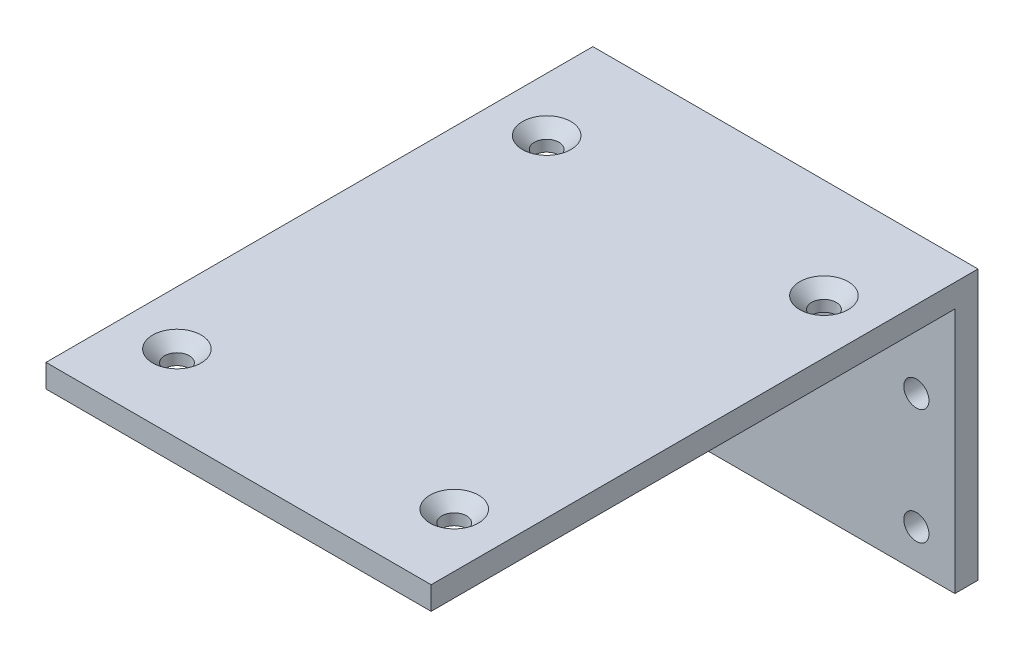
ISO-10303-21;
HEADER;
FILE_DESCRIPTION(('STEP AP214'),'2;1');
FILE_NAME('part.step','',(''),(''),'','','');
FILE_SCHEMA(('AUTOMOTIVE_DESIGN { 1 0 10303 214 1 1 1 1 }'));
ENDSEC;
DATA;
#1=APPLICATION_CONTEXT('core data for automotive mechanical design processes');
#2=APPLICATION_PROTOCOL_DEFINITION('international standard','automotive_design',2000,#1);
#3=PRODUCT_CONTEXT('',#1,'mechanical');
#4=PRODUCT('Part','Part','',(#3));
#5=PRODUCT_RELATED_PRODUCT_CATEGORY('part','',(#4));
#6=PRODUCT_DEFINITION_FORMATION('','',#4);
#7=PRODUCT_DEFINITION_CONTEXT('part definition',#1,'design');
#8=PRODUCT_DEFINITION('design','',#6,#7);
#9=PRODUCT_DEFINITION_SHAPE('','',#8);
#10=(LENGTH_UNIT() NAMED_UNIT(*) SI_UNIT(.MILLI.,.METRE.));
#11=(NAMED_UNIT(*) PLANE_ANGLE_UNIT() SI_UNIT($,.RADIAN.));
#12=(NAMED_UNIT(*) SI_UNIT($,.STERADIAN.) SOLID_ANGLE_UNIT());
#13=UNCERTAINTY_MEASURE_WITH_UNIT(LENGTH_MEASURE(1.E-05),#10,'distance_accuracy_value','');
#14=(GEOMETRIC_REPRESENTATION_CONTEXT(3) GLOBAL_UNCERTAINTY_ASSIGNED_CONTEXT((#13)) GLOBAL_UNIT_ASSIGNED_CONTEXT((#10,
#11,#12)) REPRESENTATION_CONTEXT('',''));
#15=CARTESIAN_POINT('',(0.,0.,0.));
#16=DIRECTION('',(0.,0.,1.));
#17=DIRECTION('',(1.,0.,0.));
#18=AXIS2_PLACEMENT_3D('',#15,#16,#17);
#19=CARTESIAN_POINT('',(0.,0.,153.));
#20=DIRECTION('',(0.,0.,-1.));
#21=DIRECTION('',(-1.,0.,0.));
#22=AXIS2_PLACEMENT_3D('',#19,#20,#21);
#23=PLANE('',#22);
#24=DIRECTION('',(0.,1.,0.));
#25=VECTOR('',#24,1.);
#26=CARTESIAN_POINT('',(25.,25.,153.));
#27=LINE('',#26,#25);
#28=CARTESIAN_POINT('',(25.,25.,153.));
#29=VERTEX_POINT('',#28);
#30=CARTESIAN_POINT('',(25.,57.,153.));
#31=VERTEX_POINT('',#30);
#32=EDGE_CURVE('E94',#29,#31,#27,.T.);
#33=ORIENTED_EDGE('',*,*,#32,.T.);
#34=DIRECTION('',(-1.,0.,0.));
#35=VECTOR('',#34,1.);
#36=CARTESIAN_POINT('',(-25.,57.,153.));
#37=LINE('',#36,#35);
#38=CARTESIAN_POINT('',(-25.0000000000001,57.,153.));
#39=VERTEX_POINT('',#38);
#40=EDGE_CURVE('E138',#31,#39,#37,.T.);
#41=ORIENTED_EDGE('',*,*,#40,.T.);
#42=DIRECTION('',(0.,-1.,0.));
#43=VECTOR('',#42,1.);
#44=CARTESIAN_POINT('',(-25.0000000000001,25.,153.));
#45=LINE('',#44,#43);
#46=CARTESIAN_POINT('',(-25.0000000000001,25.,153.));
#47=VERTEX_POINT('',#46);
#48=EDGE_CURVE('E148',#39,#47,#45,.T.);
#49=ORIENTED_EDGE('',*,*,#48,.T.);
#50=DIRECTION('',(1.,0.,0.));
#51=VECTOR('',#50,1.);
#52=CARTESIAN_POINT('',(-25.0000000000001,25.,153.));
#53=LINE('',#52,#51);
#54=EDGE_CURVE('E65',#47,#29,#53,.T.);
#55=ORIENTED_EDGE('',*,*,#54,.T.);
#56=EDGE_LOOP('',(#33,#41,#49,#55));
#57=FACE_BOUND('',#56,.T.);
#58=CARTESIAN_POINT('',(20.,30.,153.));
#59=DIRECTION('',(0.,0.,1.));
#60=DIRECTION('',(1.,0.,0.));
#61=AXIS2_PLACEMENT_3D('',#58,#59,#60);
#62=CIRCLE('',#61,1.635);
#63=CARTESIAN_POINT('',(21.6350000000001,30.,153.));
#64=VERTEX_POINT('',#63);
#65=EDGE_CURVE('E106',#64,#64,#62,.T.);
#66=ORIENTED_EDGE('',*,*,#65,.F.);
#67=EDGE_LOOP('',(#66));
#68=FACE_BOUND('',#67,.T.);
#69=CARTESIAN_POINT('',(20.,45.,153.));
#70=DIRECTION('',(0.,0.,1.));
#71=DIRECTION('',(1.,0.,0.));
#72=AXIS2_PLACEMENT_3D('',#69,#70,#71);
#73=CIRCLE('',#72,1.635);
#74=CARTESIAN_POINT('',(21.635,45.,153.));
#75=VERTEX_POINT('',#74);
#76=EDGE_CURVE('E152',#75,#75,#73,.T.);
#77=ORIENTED_EDGE('',*,*,#76,.F.);
#78=EDGE_LOOP('',(#77));
#79=FACE_BOUND('',#78,.T.);
#80=CARTESIAN_POINT('',(-20.,45.,153.));
#81=DIRECTION('',(0.,0.,1.));
#82=DIRECTION('',(1.,0.,0.));
#83=AXIS2_PLACEMENT_3D('',#80,#81,#82);
#84=CIRCLE('',#83,1.635);
#85=CARTESIAN_POINT('',(-18.365,45.,153.));
#86=VERTEX_POINT('',#85);
#87=EDGE_CURVE('E157',#86,#86,#84,.T.);
#88=ORIENTED_EDGE('',*,*,#87,.F.);
#89=EDGE_LOOP('',(#88));
#90=FACE_BOUND('',#89,.T.);
#91=CARTESIAN_POINT('',(-20.,30.,153.));
#92=DIRECTION('',(0.,0.,1.));
#93=DIRECTION('',(1.,0.,0.));
#94=AXIS2_PLACEMENT_3D('',#91,#92,#93);
#95=CIRCLE('',#94,1.635);
#96=CARTESIAN_POINT('',(-18.365,30.,153.));
#97=VERTEX_POINT('',#96);
#98=EDGE_CURVE('E163',#97,#97,#95,.T.);
#99=ORIENTED_EDGE('',*,*,#98,.F.);
#100=EDGE_LOOP('',(#99));
#101=FACE_BOUND('',#100,.T.);
#102=ADVANCED_FACE('F41',(#57,#68,#79,#90,#101),#23,.F.);
#103=CARTESIAN_POINT('',(0.,0.,150.));
#104=DIRECTION('',(0.,0.,-1.));
#105=DIRECTION('',(-1.,0.,0.));
#106=AXIS2_PLACEMENT_3D('',#103,#104,#105);
#107=PLANE('',#106);
#108=CARTESIAN_POINT('',(-20.,45.,150.));
#109=DIRECTION('',(0.,0.,1.));
#110=DIRECTION('',(1.,0.,0.));
#111=AXIS2_PLACEMENT_3D('',#108,#109,#110);
#112=CIRCLE('',#111,1.635);
#113=CARTESIAN_POINT('',(-18.365,45.,150.));
#114=VERTEX_POINT('',#113);
#115=EDGE_CURVE('E160',#114,#114,#112,.T.);
#116=ORIENTED_EDGE('',*,*,#115,.T.);
#117=EDGE_LOOP('',(#116));
#118=FACE_BOUND('',#117,.T.);
#119=CARTESIAN_POINT('',(20.,30.,150.));
#120=DIRECTION('',(0.,0.,1.));
#121=DIRECTION('',(1.,0.,0.));
#122=AXIS2_PLACEMENT_3D('',#119,#120,#121);
#123=CIRCLE('',#122,1.635);
#124=CARTESIAN_POINT('',(21.6350000000001,30.,150.));
#125=VERTEX_POINT('',#124);
#126=EDGE_CURVE('E110',#125,#125,#123,.T.);
#127=ORIENTED_EDGE('',*,*,#126,.T.);
#128=EDGE_LOOP('',(#127));
#129=FACE_BOUND('',#128,.T.);
#130=DIRECTION('',(0.,1.,0.));
#131=VECTOR('',#130,1.);
#132=CARTESIAN_POINT('',(25.,25.,150.));
#133=LINE('',#132,#131);
#134=CARTESIAN_POINT('',(25.,25.,150.));
#135=VERTEX_POINT('',#134);
#136=CARTESIAN_POINT('',(25.,60.,150.));
#137=VERTEX_POINT('',#136);
#138=EDGE_CURVE('E100',#135,#137,#133,.T.);
#139=ORIENTED_EDGE('',*,*,#138,.F.);
#140=DIRECTION('',(1.,0.,0.));
#141=VECTOR('',#140,1.);
#142=CARTESIAN_POINT('',(-25.0000000000001,25.,150.));
#143=LINE('',#142,#141);
#144=CARTESIAN_POINT('',(-25.0000000000001,25.,150.));
#145=VERTEX_POINT('',#144);
#146=EDGE_CURVE('E84',#145,#135,#143,.T.);
#147=ORIENTED_EDGE('',*,*,#146,.F.);
#148=DIRECTION('',(0.,-1.,0.));
#149=VECTOR('',#148,1.);
#150=CARTESIAN_POINT('',(-25.0000000000001,25.,150.));
#151=LINE('',#150,#149);
#152=CARTESIAN_POINT('',(-25.0000000000001,60.,150.));
#153=VERTEX_POINT('',#152);
#154=EDGE_CURVE('E95',#153,#145,#151,.T.);
#155=ORIENTED_EDGE('',*,*,#154,.F.);
#156=DIRECTION('',(-1.,0.,0.));
#157=VECTOR('',#156,1.);
#158=CARTESIAN_POINT('',(-25.0000000000001,60.,150.));
#159=LINE('',#158,#157);
#160=EDGE_CURVE('E105',#137,#153,#159,.T.);
#161=ORIENTED_EDGE('',*,*,#160,.F.);
#162=EDGE_LOOP('',(#139,#147,#155,#161));
#163=FACE_BOUND('',#162,.T.);
#164=CARTESIAN_POINT('',(20.,45.,150.));
#165=DIRECTION('',(0.,0.,1.));
#166=DIRECTION('',(1.,0.,0.));
#167=AXIS2_PLACEMENT_3D('',#164,#165,#166);
#168=CIRCLE('',#167,1.635);
#169=CARTESIAN_POINT('',(21.635,45.,150.));
#170=VERTEX_POINT('',#169);
#171=EDGE_CURVE('E154',#170,#170,#168,.T.);
#172=ORIENTED_EDGE('',*,*,#171,.T.);
#173=EDGE_LOOP('',(#172));
#174=FACE_BOUND('',#173,.T.);
#175=CARTESIAN_POINT('',(-20.,30.,150.));
#176=DIRECTION('',(0.,0.,1.));
#177=DIRECTION('',(1.,0.,0.));
#178=AXIS2_PLACEMENT_3D('',#175,#176,#177);
#179=CIRCLE('',#178,1.635);
#180=CARTESIAN_POINT('',(-18.365,30.,150.));
#181=VERTEX_POINT('',#180);
#182=EDGE_CURVE('E166',#181,#181,#179,.T.);
#183=ORIENTED_EDGE('',*,*,#182,.T.);
#184=EDGE_LOOP('',(#183));
#185=FACE_BOUND('',#184,.T.);
#186=ADVANCED_FACE('F103',(#118,#129,#163,#174,#185),#107,.T.);
#187=CARTESIAN_POINT('',(25.,25.,153.));
#188=DIRECTION('',(-1.,0.,0.));
#189=DIRECTION('',(0.,0.,1.));
#190=AXIS2_PLACEMENT_3D('',#187,#188,#189);
#191=PLANE('',#190);
#192=ORIENTED_EDGE('',*,*,#138,.T.);
#193=DIRECTION('',(0.,0.,-1.));
#194=VECTOR('',#193,1.);
#195=CARTESIAN_POINT('',(25.,60.,153.));
#196=LINE('',#195,#194);
#197=CARTESIAN_POINT('',(25.,60.,221.));
#198=VERTEX_POINT('',#197);
#199=EDGE_CURVE('E11',#198,#137,#196,.T.);
#200=ORIENTED_EDGE('',*,*,#199,.F.);
#201=DIRECTION('',(0.,1.,0.));
#202=VECTOR('',#201,1.);
#203=CARTESIAN_POINT('',(25.,57.,221.));
#204=LINE('',#203,#202);
#205=CARTESIAN_POINT('',(25.,57.,221.));
#206=VERTEX_POINT('',#205);
#207=EDGE_CURVE('E145',#206,#198,#204,.T.);
#208=ORIENTED_EDGE('',*,*,#207,.F.);
#209=DIRECTION('',(0.,0.,-1.));
#210=VECTOR('',#209,1.);
#211=CARTESIAN_POINT('',(25.,57.,221.));
#212=LINE('',#211,#210);
#213=EDGE_CURVE('E140',#206,#31,#212,.T.);
#214=ORIENTED_EDGE('',*,*,#213,.T.);
#215=ORIENTED_EDGE('',*,*,#32,.F.);
#216=DIRECTION('',(0.,0.,-1.));
#217=VECTOR('',#216,1.);
#218=CARTESIAN_POINT('',(25.,25.,153.));
#219=LINE('',#218,#217);
#220=EDGE_CURVE('E87',#29,#135,#219,.T.);
#221=ORIENTED_EDGE('',*,*,#220,.T.);
#222=EDGE_LOOP('',(#192,#200,#208,#214,#215,#221));
#223=FACE_BOUND('',#222,.T.);
#224=ADVANCED_FACE('F43',(#223),#191,.F.);
#225=CARTESIAN_POINT('',(-25.0000000000001,60.,153.));
#226=DIRECTION('',(0.,-1.,0.));
#227=DIRECTION('',(0.,0.,-1.));
#228=AXIS2_PLACEMENT_3D('',#225,#226,#227);
#229=PLANE('',#228);
#230=CARTESIAN_POINT('',(-17.9999999999995,60.,211.000000000001));
#231=DIRECTION('',(0.,1.,0.));
#232=DIRECTION('',(0.,0.,1.));
#233=AXIS2_PLACEMENT_3D('',#230,#231,#232);
#234=CIRCLE('',#233,3.15);
#235=CARTESIAN_POINT('',(-17.9999999999995,60.,214.150000000001));
#236=VERTEX_POINT('',#235);
#237=EDGE_CURVE('E210',#236,#236,#234,.T.);
#238=ORIENTED_EDGE('',*,*,#237,.F.);
#239=EDGE_LOOP('',(#238));
#240=FACE_BOUND('',#239,.T.);
#241=CARTESIAN_POINT('',(18.,60.,211.));
#242=DIRECTION('',(0.,1.,0.));
#243=DIRECTION('',(0.,0.,1.));
#244=AXIS2_PLACEMENT_3D('',#241,#242,#243);
#245=CIRCLE('',#244,3.15);
#246=CARTESIAN_POINT('',(18.,60.,214.15));
#247=VERTEX_POINT('',#246);
#248=EDGE_CURVE('E204',#247,#247,#245,.T.);
#249=ORIENTED_EDGE('',*,*,#248,.F.);
#250=EDGE_LOOP('',(#249));
#251=FACE_BOUND('',#250,.T.);
#252=CARTESIAN_POINT('',(17.9999999999995,60.,163.));
#253=DIRECTION('',(0.,1.,0.));
#254=DIRECTION('',(0.,0.,1.));
#255=AXIS2_PLACEMENT_3D('',#252,#253,#254);
#256=CIRCLE('',#255,3.15);
#257=CARTESIAN_POINT('',(17.9999999999995,60.,166.15));
#258=VERTEX_POINT('',#257);
#259=EDGE_CURVE('E198',#258,#258,#256,.T.);
#260=ORIENTED_EDGE('',*,*,#259,.F.);
#261=EDGE_LOOP('',(#260));
#262=FACE_BOUND('',#261,.T.);
#263=CARTESIAN_POINT('',(-18.,60.,163.));
#264=DIRECTION('',(0.,1.,0.));
#265=DIRECTION('',(0.,0.,1.));
#266=AXIS2_PLACEMENT_3D('',#263,#264,#265);
#267=CIRCLE('',#266,3.15);
#268=CARTESIAN_POINT('',(-18.,60.,166.15));
#269=VERTEX_POINT('',#268);
#270=EDGE_CURVE('E192',#269,#269,#267,.T.);
#271=ORIENTED_EDGE('',*,*,#270,.F.);
#272=EDGE_LOOP('',(#271));
#273=FACE_BOUND('',#272,.T.);
#274=ORIENTED_EDGE('',*,*,#160,.T.);
#275=DIRECTION('',(0.,0.,-1.));
#276=VECTOR('',#275,1.);
#277=CARTESIAN_POINT('',(-25.0000000000001,60.,153.));
#278=LINE('',#277,#276);
#279=CARTESIAN_POINT('',(-25.,60.,221.));
#280=VERTEX_POINT('',#279);
#281=EDGE_CURVE('E49',#280,#153,#278,.T.);
#282=ORIENTED_EDGE('',*,*,#281,.F.);
#283=DIRECTION('',(1.,0.,0.));
#284=VECTOR('',#283,1.);
#285=CARTESIAN_POINT('',(-25.,60.,221.));
#286=LINE('',#285,#284);
#287=EDGE_CURVE('E129',#280,#198,#286,.T.);
#288=ORIENTED_EDGE('',*,*,#287,.T.);
#289=ORIENTED_EDGE('',*,*,#199,.T.);
#290=EDGE_LOOP('',(#274,#282,#288,#289));
#291=FACE_BOUND('',#290,.T.);
#292=ADVANCED_FACE('F127',(#240,#251,#262,#273,#291),#229,.F.);
#293=CARTESIAN_POINT('',(-25.0000000000001,25.,153.));
#294=DIRECTION('',(1.,0.,0.));
#295=DIRECTION('',(0.,0.,-1.));
#296=AXIS2_PLACEMENT_3D('',#293,#294,#295);
#297=PLANE('',#296);
#298=ORIENTED_EDGE('',*,*,#154,.T.);
#299=DIRECTION('',(0.,0.,-1.));
#300=VECTOR('',#299,1.);
#301=CARTESIAN_POINT('',(-25.0000000000001,25.,153.));
#302=LINE('',#301,#300);
#303=EDGE_CURVE('E90',#47,#145,#302,.T.);
#304=ORIENTED_EDGE('',*,*,#303,.F.);
#305=ORIENTED_EDGE('',*,*,#48,.F.);
#306=DIRECTION('',(0.,0.,1.));
#307=VECTOR('',#306,1.);
#308=CARTESIAN_POINT('',(-25.,57.,221.));
#309=LINE('',#308,#307);
#310=CARTESIAN_POINT('',(-25.,57.,221.));
#311=VERTEX_POINT('',#310);
#312=EDGE_CURVE('E56',#39,#311,#309,.T.);
#313=ORIENTED_EDGE('',*,*,#312,.T.);
#314=DIRECTION('',(0.,1.,0.));
#315=VECTOR('',#314,1.);
#316=CARTESIAN_POINT('',(-25.,57.,221.));
#317=LINE('',#316,#315);
#318=EDGE_CURVE('E123',#311,#280,#317,.T.);
#319=ORIENTED_EDGE('',*,*,#318,.T.);
#320=ORIENTED_EDGE('',*,*,#281,.T.);
#321=EDGE_LOOP('',(#298,#304,#305,#313,#319,#320));
#322=FACE_BOUND('',#321,.T.);
#323=ADVANCED_FACE('F120',(#322),#297,.F.);
#324=CARTESIAN_POINT('',(-25.0000000000001,25.,153.));
#325=DIRECTION('',(0.,1.,0.));
#326=DIRECTION('',(0.,0.,1.));
#327=AXIS2_PLACEMENT_3D('',#324,#325,#326);
#328=PLANE('',#327);
#329=ORIENTED_EDGE('',*,*,#146,.T.);
#330=ORIENTED_EDGE('',*,*,#220,.F.);
#331=ORIENTED_EDGE('',*,*,#54,.F.);
#332=ORIENTED_EDGE('',*,*,#303,.T.);
#333=EDGE_LOOP('',(#329,#330,#331,#332));
#334=FACE_BOUND('',#333,.T.);
#335=ADVANCED_FACE('F86',(#334),#328,.F.);
#336=CARTESIAN_POINT('',(20.,30.,153.));
#337=DIRECTION('',(0.,0.,-1.));
#338=DIRECTION('',(-1.,0.,0.));
#339=AXIS2_PLACEMENT_3D('',#336,#337,#338);
#340=CYLINDRICAL_SURFACE('',#339,1.635);
#341=ORIENTED_EDGE('',*,*,#65,.T.);
#342=EDGE_LOOP('',(#341));
#343=FACE_BOUND('',#342,.T.);
#344=ORIENTED_EDGE('',*,*,#126,.F.);
#345=EDGE_LOOP('',(#344));
#346=FACE_BOUND('',#345,.T.);
#347=ADVANCED_FACE('F251',(#343,#346),#340,.F.);
#348=CARTESIAN_POINT('',(20.,45.,153.));
#349=DIRECTION('',(0.,0.,-1.));
#350=DIRECTION('',(-1.,0.,0.));
#351=AXIS2_PLACEMENT_3D('',#348,#349,#350);
#352=CYLINDRICAL_SURFACE('',#351,1.635);
#353=ORIENTED_EDGE('',*,*,#76,.T.);
#354=EDGE_LOOP('',(#353));
#355=FACE_BOUND('',#354,.T.);
#356=ORIENTED_EDGE('',*,*,#171,.F.);
#357=EDGE_LOOP('',(#356));
#358=FACE_BOUND('',#357,.T.);
#359=ADVANCED_FACE('F379',(#355,#358),#352,.F.);
#360=CARTESIAN_POINT('',(-20.,45.,153.));
#361=DIRECTION('',(0.,0.,-1.));
#362=DIRECTION('',(-1.,0.,0.));
#363=AXIS2_PLACEMENT_3D('',#360,#361,#362);
#364=CYLINDRICAL_SURFACE('',#363,1.635);
#365=ORIENTED_EDGE('',*,*,#87,.T.);
#366=EDGE_LOOP('',(#365));
#367=FACE_BOUND('',#366,.T.);
#368=ORIENTED_EDGE('',*,*,#115,.F.);
#369=EDGE_LOOP('',(#368));
#370=FACE_BOUND('',#369,.T.);
#371=ADVANCED_FACE('F370',(#367,#370),#364,.F.);
#372=CARTESIAN_POINT('',(-20.,30.,153.));
#373=DIRECTION('',(0.,0.,-1.));
#374=DIRECTION('',(-1.,0.,0.));
#375=AXIS2_PLACEMENT_3D('',#372,#373,#374);
#376=CYLINDRICAL_SURFACE('',#375,1.635);
#377=ORIENTED_EDGE('',*,*,#98,.T.);
#378=EDGE_LOOP('',(#377));
#379=FACE_BOUND('',#378,.T.);
#380=ORIENTED_EDGE('',*,*,#182,.F.);
#381=EDGE_LOOP('',(#380));
#382=FACE_BOUND('',#381,.T.);
#383=ADVANCED_FACE('F270',(#379,#382),#376,.F.);
#384=CARTESIAN_POINT('',(-25.,57.,221.));
#385=DIRECTION('',(0.,0.,1.));
#386=DIRECTION('',(1.,0.,0.));
#387=AXIS2_PLACEMENT_3D('',#384,#385,#386);
#388=PLANE('',#387);
#389=ORIENTED_EDGE('',*,*,#287,.F.);
#390=ORIENTED_EDGE('',*,*,#318,.F.);
#391=DIRECTION('',(1.,0.,0.));
#392=VECTOR('',#391,1.);
#393=CARTESIAN_POINT('',(-25.,57.,221.));
#394=LINE('',#393,#392);
#395=EDGE_CURVE('E172',#311,#206,#394,.T.);
#396=ORIENTED_EDGE('',*,*,#395,.T.);
#397=ORIENTED_EDGE('',*,*,#207,.T.);
#398=EDGE_LOOP('',(#389,#390,#396,#397));
#399=FACE_BOUND('',#398,.T.);
#400=ADVANCED_FACE('F267',(#399),#388,.T.);
#401=CARTESIAN_POINT('',(0.,57.,0.));
#402=DIRECTION('',(0.,-1.,0.));
#403=DIRECTION('',(0.,0.,-1.));
#404=AXIS2_PLACEMENT_3D('',#401,#402,#403);
#405=PLANE('',#404);
#406=CARTESIAN_POINT('',(-17.9999999999995,57.,211.000000000001));
#407=DIRECTION('',(0.,1.,0.));
#408=DIRECTION('',(0.,0.,1.));
#409=AXIS2_PLACEMENT_3D('',#406,#407,#408);
#410=CIRCLE('',#409,1.6);
#411=CARTESIAN_POINT('',(-17.9999999999995,57.,212.600000000001));
#412=VERTEX_POINT('',#411);
#413=EDGE_CURVE('E186',#412,#412,#410,.T.);
#414=ORIENTED_EDGE('',*,*,#413,.T.);
#415=EDGE_LOOP('',(#414));
#416=FACE_BOUND('',#415,.T.);
#417=CARTESIAN_POINT('',(18.,57.,211.));
#418=DIRECTION('',(0.,1.,0.));
#419=DIRECTION('',(0.,0.,1.));
#420=AXIS2_PLACEMENT_3D('',#417,#418,#419);
#421=CIRCLE('',#420,1.59999999999999);
#422=CARTESIAN_POINT('',(18.,57.,212.6));
#423=VERTEX_POINT('',#422);
#424=EDGE_CURVE('E183',#423,#423,#421,.T.);
#425=ORIENTED_EDGE('',*,*,#424,.T.);
#426=EDGE_LOOP('',(#425));
#427=FACE_BOUND('',#426,.T.);
#428=CARTESIAN_POINT('',(17.9999999999995,57.,163.));
#429=DIRECTION('',(0.,1.,0.));
#430=DIRECTION('',(0.,0.,1.));
#431=AXIS2_PLACEMENT_3D('',#428,#429,#430);
#432=CIRCLE('',#431,1.6);
#433=CARTESIAN_POINT('',(17.9999999999995,57.,164.599999999999));
#434=VERTEX_POINT('',#433);
#435=EDGE_CURVE('E180',#434,#434,#432,.T.);
#436=ORIENTED_EDGE('',*,*,#435,.T.);
#437=EDGE_LOOP('',(#436));
#438=FACE_BOUND('',#437,.T.);
#439=CARTESIAN_POINT('',(-18.,57.,163.));
#440=DIRECTION('',(0.,1.,0.));
#441=DIRECTION('',(0.,0.,1.));
#442=AXIS2_PLACEMENT_3D('',#439,#440,#441);
#443=CIRCLE('',#442,1.6);
#444=CARTESIAN_POINT('',(-18.,57.,164.6));
#445=VERTEX_POINT('',#444);
#446=EDGE_CURVE('E175',#445,#445,#443,.T.);
#447=ORIENTED_EDGE('',*,*,#446,.T.);
#448=EDGE_LOOP('',(#447));
#449=FACE_BOUND('',#448,.T.);
#450=ORIENTED_EDGE('',*,*,#213,.F.);
#451=ORIENTED_EDGE('',*,*,#395,.F.);
#452=ORIENTED_EDGE('',*,*,#312,.F.);
#453=ORIENTED_EDGE('',*,*,#40,.F.);
#454=EDGE_LOOP('',(#450,#451,#452,#453));
#455=FACE_BOUND('',#454,.T.);
#456=ADVANCED_FACE('F139',(#416,#427,#438,#449,#455),#405,.T.);
#457=CARTESIAN_POINT('',(-18.,57.,163.));
#458=DIRECTION('',(0.,1.,0.));
#459=DIRECTION('',(0.,0.,1.));
#460=AXIS2_PLACEMENT_3D('',#457,#458,#459);
#461=CYLINDRICAL_SURFACE('',#460,1.6);
#462=CARTESIAN_POINT('',(-18.,58.45,163.));
#463=DIRECTION('',(0.,1.,0.));
#464=DIRECTION('',(0.,0.,1.));
#465=AXIS2_PLACEMENT_3D('',#462,#463,#464);
#466=CIRCLE('',#465,1.6);
#467=CARTESIAN_POINT('',(-18.,58.45,164.6));
#468=VERTEX_POINT('',#467);
#469=EDGE_CURVE('E189',#468,#468,#466,.T.);
#470=ORIENTED_EDGE('',*,*,#469,.T.);
#471=EDGE_LOOP('',(#470));
#472=FACE_BOUND('',#471,.T.);
#473=ORIENTED_EDGE('',*,*,#446,.F.);
#474=EDGE_LOOP('',(#473));
#475=FACE_BOUND('',#474,.T.);
#476=ADVANCED_FACE('F278',(#472,#475),#461,.F.);
#477=CARTESIAN_POINT('',(17.9999999999995,57.,163.));
#478=DIRECTION('',(0.,1.,0.));
#479=DIRECTION('',(0.,0.,1.));
#480=AXIS2_PLACEMENT_3D('',#477,#478,#479);
#481=CYLINDRICAL_SURFACE('',#480,1.6);
#482=CARTESIAN_POINT('',(17.9999999999995,58.45,163.));
#483=DIRECTION('',(0.,1.,0.));
#484=DIRECTION('',(0.,0.,1.));
#485=AXIS2_PLACEMENT_3D('',#482,#483,#484);
#486=CIRCLE('',#485,1.6);
#487=CARTESIAN_POINT('',(17.9999999999995,58.45,164.599999999999));
#488=VERTEX_POINT('',#487);
#489=EDGE_CURVE('E195',#488,#488,#486,.T.);
#490=ORIENTED_EDGE('',*,*,#489,.T.);
#491=EDGE_LOOP('',(#490));
#492=FACE_BOUND('',#491,.T.);
#493=ORIENTED_EDGE('',*,*,#435,.F.);
#494=EDGE_LOOP('',(#493));
#495=FACE_BOUND('',#494,.T.);
#496=ADVANCED_FACE('F292',(#492,#495),#481,.F.);
#497=CARTESIAN_POINT('',(18.,57.,211.));
#498=DIRECTION('',(0.,1.,0.));
#499=DIRECTION('',(0.,0.,1.));
#500=AXIS2_PLACEMENT_3D('',#497,#498,#499);
#501=CYLINDRICAL_SURFACE('',#500,1.59999999999999);
#502=CARTESIAN_POINT('',(18.,58.45,211.));
#503=DIRECTION('',(0.,1.,0.));
#504=DIRECTION('',(0.,0.,1.));
#505=AXIS2_PLACEMENT_3D('',#502,#503,#504);
#506=CIRCLE('',#505,1.6);
#507=CARTESIAN_POINT('',(18.,58.45,212.6));
#508=VERTEX_POINT('',#507);
#509=EDGE_CURVE('E201',#508,#508,#506,.T.);
#510=ORIENTED_EDGE('',*,*,#509,.T.);
#511=EDGE_LOOP('',(#510));
#512=FACE_BOUND('',#511,.T.);
#513=ORIENTED_EDGE('',*,*,#424,.F.);
#514=EDGE_LOOP('',(#513));
#515=FACE_BOUND('',#514,.T.);
#516=ADVANCED_FACE('F237',(#512,#515),#501,.F.);
#517=CARTESIAN_POINT('',(-17.9999999999995,57.,211.000000000001));
#518=DIRECTION('',(0.,1.,0.));
#519=DIRECTION('',(0.,0.,1.));
#520=AXIS2_PLACEMENT_3D('',#517,#518,#519);
#521=CYLINDRICAL_SURFACE('',#520,1.6);
#522=CARTESIAN_POINT('',(-17.9999999999995,58.45,211.000000000001));
#523=DIRECTION('',(0.,1.,0.));
#524=DIRECTION('',(0.,0.,1.));
#525=AXIS2_PLACEMENT_3D('',#522,#523,#524);
#526=CIRCLE('',#525,1.6);
#527=CARTESIAN_POINT('',(-17.9999999999995,58.45,212.600000000001));
#528=VERTEX_POINT('',#527);
#529=EDGE_CURVE('E207',#528,#528,#526,.T.);
#530=ORIENTED_EDGE('',*,*,#529,.T.);
#531=EDGE_LOOP('',(#530));
#532=FACE_BOUND('',#531,.T.);
#533=ORIENTED_EDGE('',*,*,#413,.F.);
#534=EDGE_LOOP('',(#533));
#535=FACE_BOUND('',#534,.T.);
#536=ADVANCED_FACE('F227',(#532,#535),#521,.F.);
#537=CARTESIAN_POINT('',(-18.,60.,163.));
#538=DIRECTION('',(0.,1.,0.));
#539=DIRECTION('',(0.,0.,1.));
#540=AXIS2_PLACEMENT_3D('',#537,#538,#539);
#541=CONICAL_SURFACE('',#540,3.15,0.785398163397448);
#542=ORIENTED_EDGE('',*,*,#469,.F.);
#543=EDGE_LOOP('',(#542));
#544=FACE_BOUND('',#543,.T.);
#545=ORIENTED_EDGE('',*,*,#270,.T.);
#546=EDGE_LOOP('',(#545));
#547=FACE_BOUND('',#546,.T.);
#548=ADVANCED_FACE('F224',(#544,#547),#541,.F.);
#549=CARTESIAN_POINT('',(17.9999999999995,60.,163.));
#550=DIRECTION('',(0.,1.,0.));
#551=DIRECTION('',(0.,0.,1.));
#552=AXIS2_PLACEMENT_3D('',#549,#550,#551);
#553=CONICAL_SURFACE('',#552,3.15,0.785398163397448);
#554=ORIENTED_EDGE('',*,*,#489,.F.);
#555=EDGE_LOOP('',(#554));
#556=FACE_BOUND('',#555,.T.);
#557=ORIENTED_EDGE('',*,*,#259,.T.);
#558=EDGE_LOOP('',(#557));
#559=FACE_BOUND('',#558,.T.);
#560=ADVANCED_FACE('F226',(#556,#559),#553,.F.);
#561=CARTESIAN_POINT('',(18.,60.,211.));
#562=DIRECTION('',(0.,1.,0.));
#563=DIRECTION('',(0.,0.,1.));
#564=AXIS2_PLACEMENT_3D('',#561,#562,#563);
#565=CONICAL_SURFACE('',#564,3.15,0.785398163397448);
#566=ORIENTED_EDGE('',*,*,#509,.F.);
#567=EDGE_LOOP('',(#566));
#568=FACE_BOUND('',#567,.T.);
#569=ORIENTED_EDGE('',*,*,#248,.T.);
#570=EDGE_LOOP('',(#569));
#571=FACE_BOUND('',#570,.T.);
#572=ADVANCED_FACE('F234',(#568,#571),#565,.F.);
#573=CARTESIAN_POINT('',(-17.9999999999995,60.,211.000000000001));
#574=DIRECTION('',(0.,1.,0.));
#575=DIRECTION('',(0.,0.,1.));
#576=AXIS2_PLACEMENT_3D('',#573,#574,#575);
#577=CONICAL_SURFACE('',#576,3.15,0.785398163397448);
#578=ORIENTED_EDGE('',*,*,#529,.F.);
#579=EDGE_LOOP('',(#578));
#580=FACE_BOUND('',#579,.T.);
#581=ORIENTED_EDGE('',*,*,#237,.T.);
#582=EDGE_LOOP('',(#581));
#583=FACE_BOUND('',#582,.T.);
#584=ADVANCED_FACE('F214',(#580,#583),#577,.F.);
#585=CLOSED_SHELL('',(#102,#186,#224,#292,#323,#335,#347,#359,#371,#383,#400,#456,#476,#496,
#516,#536,#548,#560,#572,#584));
#586=MANIFOLD_SOLID_BREP('B2',#585);
#587=ADVANCED_BREP_SHAPE_REPRESENTATION('',(#18,#586),#14);
#588=SHAPE_DEFINITION_REPRESENTATION(#9,#587);
ENDSEC;
END-ISO-10303-21;
